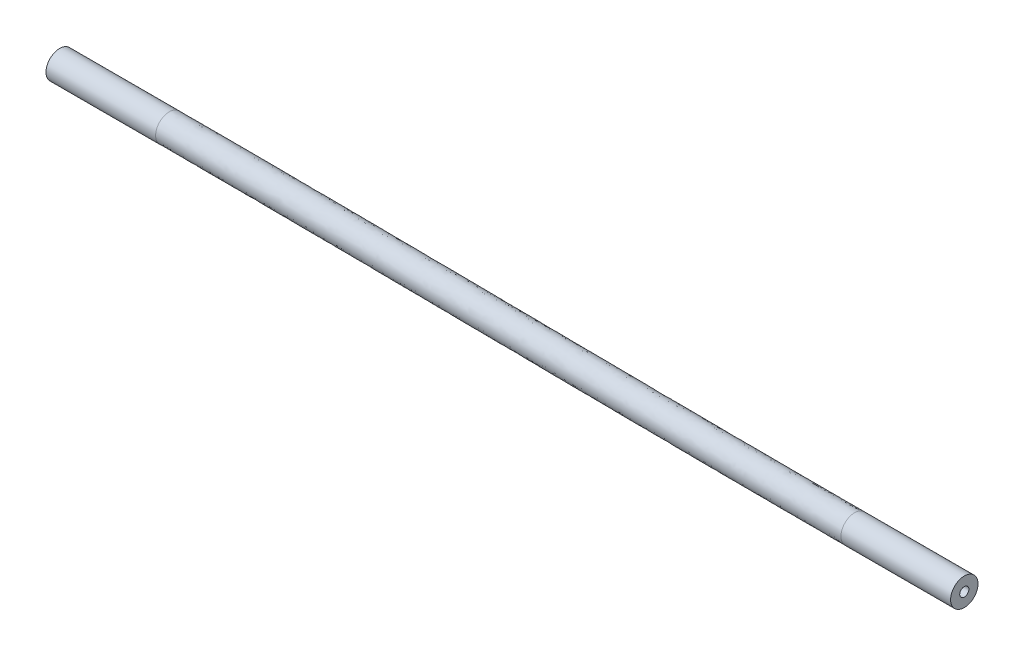
ISO-10303-21;
HEADER;
FILE_DESCRIPTION(('STEP AP214'),'2;1');
FILE_NAME('part.step','',(''),(''),'','','');
FILE_SCHEMA(('AUTOMOTIVE_DESIGN { 1 0 10303 214 1 1 1 1 }'));
ENDSEC;
DATA;
#1=APPLICATION_CONTEXT('core data for automotive mechanical design processes');
#2=APPLICATION_PROTOCOL_DEFINITION('international standard','automotive_design',2000,#1);
#3=PRODUCT_CONTEXT('',#1,'mechanical');
#4=PRODUCT('Part','Part','',(#3));
#5=PRODUCT_RELATED_PRODUCT_CATEGORY('part','',(#4));
#6=PRODUCT_DEFINITION_FORMATION('','',#4);
#7=PRODUCT_DEFINITION_CONTEXT('part definition',#1,'design');
#8=PRODUCT_DEFINITION('design','',#6,#7);
#9=PRODUCT_DEFINITION_SHAPE('','',#8);
#10=(LENGTH_UNIT() NAMED_UNIT(*) SI_UNIT(.MILLI.,.METRE.));
#11=(NAMED_UNIT(*) PLANE_ANGLE_UNIT() SI_UNIT($,.RADIAN.));
#12=(NAMED_UNIT(*) SI_UNIT($,.STERADIAN.) SOLID_ANGLE_UNIT());
#13=UNCERTAINTY_MEASURE_WITH_UNIT(LENGTH_MEASURE(1.E-05),#10,'distance_accuracy_value','');
#14=(GEOMETRIC_REPRESENTATION_CONTEXT(3) GLOBAL_UNCERTAINTY_ASSIGNED_CONTEXT((#13)) GLOBAL_UNIT_ASSIGNED_CONTEXT((#10,
#11,#12)) REPRESENTATION_CONTEXT('',''));
#15=CARTESIAN_POINT('',(0.,0.,0.));
#16=DIRECTION('',(0.,0.,1.));
#17=DIRECTION('',(1.,0.,0.));
#18=AXIS2_PLACEMENT_3D('',#15,#16,#17);
#19=CARTESIAN_POINT('',(98.9999999999895,-0.5,0.));
#20=DIRECTION('',(-1.,0.,0.));
#21=DIRECTION('',(0.,-1.,0.));
#22=AXIS2_PLACEMENT_3D('',#19,#20,#21);
#23=CYLINDRICAL_SURFACE('',#22,1.5);
#24=CARTESIAN_POINT('',(87.,-0.499999999999998,0.));
#25=DIRECTION('',(1.,0.,0.));
#26=DIRECTION('',(0.,0.,-1.));
#27=AXIS2_PLACEMENT_3D('',#24,#25,#26);
#28=CIRCLE('',#27,1.5);
#29=CARTESIAN_POINT('',(87.,-0.499999999999998,-1.5));
#30=VERTEX_POINT('',#29);
#31=EDGE_CURVE('E54',#30,#30,#28,.T.);
#32=ORIENTED_EDGE('',*,*,#31,.T.);
#33=EDGE_LOOP('',(#32));
#34=FACE_BOUND('',#33,.T.);
#35=CARTESIAN_POINT('',(98.9999999999895,-0.5,0.));
#36=DIRECTION('',(1.,0.,0.));
#37=DIRECTION('',(0.,0.,-1.));
#38=AXIS2_PLACEMENT_3D('',#35,#36,#37);
#39=CIRCLE('',#38,1.5);
#40=CARTESIAN_POINT('',(98.9999999999895,-0.5,-1.5));
#41=VERTEX_POINT('',#40);
#42=EDGE_CURVE('E52',#41,#41,#39,.T.);
#43=ORIENTED_EDGE('',*,*,#42,.F.);
#44=EDGE_LOOP('',(#43));
#45=FACE_BOUND('',#44,.T.);
#46=ADVANCED_FACE('F31',(#34,#45),#23,.T.);
#47=CARTESIAN_POINT('',(87.,-0.499999999999998,-1.5));
#48=CARTESIAN_POINT('',(74.4994166426159,-0.499999999999998,-1.5));
#49=CARTESIAN_POINT('',(61.9995833192456,-0.374999999969188,-1.5));
#50=CARTESIAN_POINT('',(37.0004166807542,-0.12500000003081,-1.5));
#51=CARTESIAN_POINT('',(24.500583357384,0.,-1.5));
#52=CARTESIAN_POINT('',(12.,0.,-1.5));
#53=CARTESIAN_POINT('',(87.,2.50000000000001,-1.5));
#54=CARTESIAN_POINT('',(74.5094159759715,2.50000000000001,-1.5));
#55=CARTESIAN_POINT('',(62.0295828192748,2.62485000128055,-1.5));
#56=CARTESIAN_POINT('',(37.0304161807834,2.87485000121893,-1.5));
#57=CARTESIAN_POINT('',(24.5105826907396,3.00000000000001,-1.5));
#58=CARTESIAN_POINT('',(12.,3.00000000000001,-1.5));
#59=CARTESIAN_POINT('',(87.,2.50000000000001,1.5));
#60=CARTESIAN_POINT('',(74.5094159759715,2.50000000000001,1.5));
#61=CARTESIAN_POINT('',(62.0295828192748,2.62485000128055,1.5));
#62=CARTESIAN_POINT('',(37.0304161807834,2.87485000121893,1.5));
#63=CARTESIAN_POINT('',(24.5105826907396,3.00000000000001,1.5));
#64=CARTESIAN_POINT('',(12.,3.00000000000001,1.5));
#65=CARTESIAN_POINT('',(87.,-0.499999999999998,1.5));
#66=CARTESIAN_POINT('',(74.4994166426159,-0.499999999999997,1.5));
#67=CARTESIAN_POINT('',(61.9995833192456,-0.374999999969188,1.5));
#68=CARTESIAN_POINT('',(37.0004166807542,-0.12500000003081,1.5));
#69=CARTESIAN_POINT('',(24.500583357384,0.,1.5));
#70=CARTESIAN_POINT('',(12.,0.,1.5));
#71=CARTESIAN_POINT('',(87.,-3.50000000000001,1.5));
#72=CARTESIAN_POINT('',(74.4894173092604,-3.5,1.5));
#73=CARTESIAN_POINT('',(61.9695838192165,-3.37485000121892,1.5));
#74=CARTESIAN_POINT('',(36.970417180725,-3.12485000128055,1.5));
#75=CARTESIAN_POINT('',(24.4905840240285,-3.00000000000001,1.5));
#76=CARTESIAN_POINT('',(12.,-3.00000000000001,1.5));
#77=CARTESIAN_POINT('',(87.,-3.50000000000001,-1.5));
#78=CARTESIAN_POINT('',(74.4894173092604,-3.5,-1.5));
#79=CARTESIAN_POINT('',(61.9695838192165,-3.37485000121892,-1.5));
#80=CARTESIAN_POINT('',(36.970417180725,-3.12485000128055,-1.5));
#81=CARTESIAN_POINT('',(24.4905840240285,-3.00000000000001,-1.5));
#82=CARTESIAN_POINT('',(12.,-3.00000000000001,-1.5));
#83=CARTESIAN_POINT('',(87.,-0.499999999999998,-1.5));
#84=CARTESIAN_POINT('',(74.4994166426159,-0.499999999999998,-1.5));
#85=CARTESIAN_POINT('',(61.9995833192456,-0.374999999969188,-1.5));
#86=CARTESIAN_POINT('',(37.0004166807542,-0.12500000003081,-1.5));
#87=CARTESIAN_POINT('',(24.500583357384,0.,-1.5));
#88=CARTESIAN_POINT('',(12.,0.,-1.5));
#89=(BOUNDED_SURFACE() B_SPLINE_SURFACE(3,3,((#47,#48,#49,#50,#51,#52),(#53,#54,#55,#56,#57,
#58),(#59,#60,#61,#62,#63,#64),(#65,#66,#67,#68,#69,#70),(#71,#72,#73,#74,#75,#76),(#77,#78,#79,
#80,#81,#82),(#83,#84,#85,#86,#87,#88)),.UNSPECIFIED.,.T.,.F.,
.F.) B_SPLINE_SURFACE_WITH_KNOTS((4,3,4),(4,2,4),(0.,0.5,1.),(0.121209672382494,
0.499999999999947,0.878790327617401),
.UNSPECIFIED.) GEOMETRIC_REPRESENTATION_ITEM() RATIONAL_B_SPLINE_SURFACE(((1.,1.,1.,1.,1.,1.),
(0.333333333333333,0.333333333333333,0.333333333333333,0.333333333333333,0.333333333333333,
0.333333333333333),(0.333333333333333,0.333333333333333,0.333333333333333,0.333333333333333,
0.333333333333333,0.333333333333333),(1.,1.,1.,1.,1.,1.),(0.333333333333333,0.333333333333333,
0.333333333333333,0.333333333333333,0.333333333333333,0.333333333333333),(0.333333333333333,
0.333333333333333,0.333333333333333,0.333333333333333,0.333333333333333,0.333333333333333),(1.,
1.,1.,1.,1.,1.))) REPRESENTATION_ITEM('') SURFACE());
#90=CARTESIAN_POINT('',(12.,0.,0.));
#91=DIRECTION('',(1.,0.,0.));
#92=DIRECTION('',(0.,0.,-1.));
#93=AXIS2_PLACEMENT_3D('',#90,#91,#92);
#94=CIRCLE('',#93,1.5);
#95=CARTESIAN_POINT('',(12.,0.,-1.5));
#96=VERTEX_POINT('',#95);
#97=EDGE_CURVE('E35',#96,#96,#94,.T.);
#98=CARTESIAN_POINT('',(12.,0.,-1.5));
#99=CARTESIAN_POINT('',(12.7812838064446,1.392312673048E-09,-1.5));
#100=CARTESIAN_POINT('',(13.5625675334599,-0.000488277906319333,-1.5));
#101=CARTESIAN_POINT('',(15.125129371996,-0.00238036896634106,-1.5));
#102=CARTESIAN_POINT('',(15.9064074835231,-0.00378417543244554,-1.5));
#103=CARTESIAN_POINT('',(17.4689582922819,-0.00744628539896462,-1.5));
#104=CARTESIAN_POINT('',(18.2502309895223,-0.00970458520281917,-1.5));
#105=CARTESIAN_POINT('',(19.8127712283929,-0.0150146447882255,-1.5));
#106=CARTESIAN_POINT('',(20.5940387700315,-0.0180664020906396,-1.5));
#107=CARTESIAN_POINT('',(22.1565689409835,-0.0249023405321176,-1.5));
#108=CARTESIAN_POINT('',(22.9378315703038,-0.0286865200884703,-1.5));
#109=CARTESIAN_POINT('',(24.5003521640324,-0.0369262670545113,-1.5));
#110=CARTESIAN_POINT('',(25.2816101284457,-0.0413818335127842,-1.5));
#111=CARTESIAN_POINT('',(26.8441216386678,-0.050903318589459,-1.5));
#112=CARTESIAN_POINT('',(27.6253751844799,-0.0559692366740106,-1.5));
#113=CARTESIAN_POINT('',(29.1878781041033,-0.0666503894999829,-1.5));
#114=CARTESIAN_POINT('',(29.9691274779165,-0.072265623958323,-1.5));
#115=CARTESIAN_POINT('',(31.5316223000658,-0.083984374185118,-1.5));
#116=CARTESIAN_POINT('',(32.3128677484031,-0.0900878897969335,-1.5));
#117=CARTESIAN_POINT('',(33.8753549661451,-0.102722167099443,-1.5));
#118=CARTESIAN_POINT('',(34.6565967355506,-0.109252928673607,-1.5));
#119=CARTESIAN_POINT('',(36.2190768419674,-0.122680662734389,-1.5));
#120=CARTESIAN_POINT('',(37.0003151789797,-0.129577635091783,-1.5));
#121=CARTESIAN_POINT('',(38.5627886671489,-0.143676755639944,-1.5));
#122=CARTESIAN_POINT('',(39.3440238183073,-0.150878903665046,-1.5));
#123=CARTESIAN_POINT('',(40.9064911813087,-0.165527340322999,-1.5));
#124=CARTESIAN_POINT('',(41.6877233931536,-0.172973628754582,-1.5));
#125=CARTESIAN_POINT('',(43.2501851240622,-0.188049311598723,-1.5));
#126=CARTESIAN_POINT('',(44.0314146431279,-0.195678705795359,-1.5));
#127=CARTESIAN_POINT('',(45.5938712350351,-0.211059563253201,-1.5));
#128=CARTESIAN_POINT('',(46.3750983078785,-0.218811026320434,-1.5));
#129=CARTESIAN_POINT('',(47.9375502538137,-0.234374993007952,-1.5));
#130=CARTESIAN_POINT('',(48.7187751269068,-0.242187496503976,-1.5));
#131=CARTESIAN_POINT('',(50.281224873093,-0.257812503496022,-1.5));
#132=CARTESIAN_POINT('',(51.0624497461861,-0.265625006992046,-1.5));
#133=CARTESIAN_POINT('',(52.6249016921214,-0.281188973679565,-1.5));
#134=CARTESIAN_POINT('',(53.4061287649648,-0.288940436746798,-1.5));
#135=CARTESIAN_POINT('',(54.968585356872,-0.304321294204639,-1.5));
#136=CARTESIAN_POINT('',(55.7498148759377,-0.311950688401275,-1.5));
#137=CARTESIAN_POINT('',(57.3122766068463,-0.327026371245416,-1.5));
#138=CARTESIAN_POINT('',(58.0935088186912,-0.334472659676999,-1.5));
#139=CARTESIAN_POINT('',(59.6559761816926,-0.349121096334953,-1.5));
#140=CARTESIAN_POINT('',(60.437211332851,-0.356323244360054,-1.5));
#141=CARTESIAN_POINT('',(61.9996848210202,-0.370422364908215,-1.5));
#142=CARTESIAN_POINT('',(62.7809231580325,-0.377319337265609,-1.5));
#143=CARTESIAN_POINT('',(64.3434032644493,-0.390747071326391,-1.5));
#144=CARTESIAN_POINT('',(65.1246450338548,-0.397277832900555,-1.5));
#145=CARTESIAN_POINT('',(66.6871322515968,-0.409912110203065,-1.5));
#146=CARTESIAN_POINT('',(67.4683776999341,-0.41601562581488,-1.5));
#147=CARTESIAN_POINT('',(69.0308725220834,-0.427734376041675,-1.5));
#148=CARTESIAN_POINT('',(69.8121218958967,-0.433349610500015,-1.5));
#149=CARTESIAN_POINT('',(71.37462481552,-0.444030763325987,-1.5));
#150=CARTESIAN_POINT('',(72.1558783613321,-0.449096681410539,-1.5));
#151=CARTESIAN_POINT('',(73.7183898715543,-0.458618166487214,-1.5));
#152=CARTESIAN_POINT('',(74.4996478359676,-0.463073732945487,-1.5));
#153=CARTESIAN_POINT('',(76.0621684296962,-0.471313479911528,-1.5));
#154=CARTESIAN_POINT('',(76.8434310590165,-0.47509765946788,-1.5));
#155=CARTESIAN_POINT('',(78.4059612299685,-0.481933597909358,-1.5));
#156=CARTESIAN_POINT('',(79.1872287716071,-0.484985355211773,-1.5));
#157=CARTESIAN_POINT('',(80.7497690104777,-0.490295414797179,-1.5));
#158=CARTESIAN_POINT('',(81.5310417077181,-0.492553714601033,-1.5));
#159=CARTESIAN_POINT('',(83.0935925164769,-0.496215824567553,-1.5));
#160=CARTESIAN_POINT('',(83.874870628004,-0.497619631033657,-1.5));
#161=CARTESIAN_POINT('',(85.43743246654,-0.499511722093679,-1.5));
#162=CARTESIAN_POINT('',(86.2187161935554,-0.50000000139231,-1.5));
#163=CARTESIAN_POINT('',(87.,-0.499999999999998,-1.5));
#164=B_SPLINE_CURVE_WITH_KNOTS('',3,(#98,#99,#100,#101,#102,#103,#104,#105,#106,#107,#108,#109,
#110,#111,#112,#113,#114,#115,#116,#117,#118,#119,#120,#121,#122,#123,#124,#125,#126,#127,#128,
#129,#130,#131,#132,#133,#134,#135,#136,#137,#138,#139,#140,#141,#142,#143,#144,#145,#146,#147,
#148,#149,#150,#151,#152,#153,#154,#155,#156,#157,#158,#159,#160,#161,#162,#163),.UNSPECIFIED.,
.F.,.F.,(4,2,2,2,2,2,2,2,2,2,2,2,2,2,2,2,2,2,2,2,2,2,2,2,2,2,2,2,2,2,2,2,4),(0.,
2.34385115099598,4.68768874559432,7.03151620080718,9.37533633287918,11.719151400183,
14.0629631461218,16.4067728420363,18.7505813301155,21.0943890663095,23.4381961632435,
25.7820024331322,28.1258074306948,30.4696104960685,32.8134107977234,35.1572073753754,
37.5009991828998,39.8447909904242,42.1885875680762,44.5323878697311,46.8761909351049,
49.2199959326674,51.5638022025562,53.9076092994902,56.2514170356842,58.5952255237634,
60.9390352196779,63.2828469656167,65.6266620329206,67.9704821649926,70.3143096202054,
72.6581472148038,75.0019983657998),.UNSPECIFIED.);
#165=EDGE_CURVE('BSEAM61',#96,#30,#164,.T.);
#166=ORIENTED_EDGE('',*,*,#97,.T.);
#167=ORIENTED_EDGE('',*,*,#31,.F.);
#168=ORIENTED_EDGE('',*,*,#165,.T.);
#169=ORIENTED_EDGE('',*,*,#165,.F.);
#170=EDGE_LOOP('',(#166,#168,#167,#169));
#171=FACE_BOUND('',#170,.T.);
#172=ADVANCED_FACE('F61',(#171),#89,.F.);
#173=CARTESIAN_POINT('',(12.,0.,0.));
#174=DIRECTION('',(-1.,0.,0.));
#175=DIRECTION('',(0.,0.,1.));
#176=AXIS2_PLACEMENT_3D('',#173,#174,#175);
#177=CYLINDRICAL_SURFACE('',#176,1.5);
#178=CARTESIAN_POINT('',(0.,0.,0.));
#179=DIRECTION('',(1.,0.,0.));
#180=DIRECTION('',(0.,0.,-1.));
#181=AXIS2_PLACEMENT_3D('',#178,#179,#180);
#182=CIRCLE('',#181,1.5);
#183=CARTESIAN_POINT('',(0.,0.,-1.5));
#184=VERTEX_POINT('',#183);
#185=EDGE_CURVE('E48',#184,#184,#182,.T.);
#186=ORIENTED_EDGE('',*,*,#185,.T.);
#187=EDGE_LOOP('',(#186));
#188=FACE_BOUND('',#187,.T.);
#189=ORIENTED_EDGE('',*,*,#97,.F.);
#190=EDGE_LOOP('',(#189));
#191=FACE_BOUND('',#190,.T.);
#192=ADVANCED_FACE('F33',(#188,#191),#177,.T.);
#193=CARTESIAN_POINT('',(98.9999999999895,-0.5,0.));
#194=DIRECTION('',(1.,0.,0.));
#195=DIRECTION('',(0.,0.,-1.));
#196=AXIS2_PLACEMENT_3D('',#193,#194,#195);
#197=PLANE('',#196);
#198=CARTESIAN_POINT('',(98.9999999999895,-0.5,0.));
#199=DIRECTION('',(1.,0.,0.));
#200=DIRECTION('',(0.,0.,-1.));
#201=AXIS2_PLACEMENT_3D('',#198,#199,#200);
#202=CIRCLE('',#201,0.5);
#203=CARTESIAN_POINT('',(98.9999999999895,-0.5,-0.5));
#204=VERTEX_POINT('',#203);
#205=EDGE_CURVE('E51',#204,#204,#202,.F.);
#206=ORIENTED_EDGE('',*,*,#205,.T.);
#207=EDGE_LOOP('',(#206));
#208=FACE_BOUND('',#207,.T.);
#209=ORIENTED_EDGE('',*,*,#42,.T.);
#210=EDGE_LOOP('',(#209));
#211=FACE_BOUND('',#210,.T.);
#212=ADVANCED_FACE('F65',(#208,#211),#197,.T.);
#213=CARTESIAN_POINT('',(0.,0.,0.));
#214=DIRECTION('',(1.,0.,0.));
#215=DIRECTION('',(0.,0.,-1.));
#216=AXIS2_PLACEMENT_3D('',#213,#214,#215);
#217=PLANE('',#216);
#218=CARTESIAN_POINT('',(0.,0.,0.));
#219=DIRECTION('',(1.,0.,0.));
#220=DIRECTION('',(0.,0.,-1.));
#221=AXIS2_PLACEMENT_3D('',#218,#219,#220);
#222=CIRCLE('',#221,0.5);
#223=CARTESIAN_POINT('',(0.,0.,-0.5));
#224=VERTEX_POINT('',#223);
#225=EDGE_CURVE('E10',#224,#224,#222,.F.);
#226=ORIENTED_EDGE('',*,*,#225,.F.);
#227=EDGE_LOOP('',(#226));
#228=FACE_BOUND('',#227,.T.);
#229=ORIENTED_EDGE('',*,*,#185,.F.);
#230=EDGE_LOOP('',(#229));
#231=FACE_BOUND('',#230,.T.);
#232=ADVANCED_FACE('F71',(#228,#231),#217,.F.);
#233=CARTESIAN_POINT('',(98.9999999999895,-0.5,0.));
#234=DIRECTION('',(-1.,0.,0.));
#235=DIRECTION('',(0.,-1.,0.));
#236=AXIS2_PLACEMENT_3D('',#233,#234,#235);
#237=CYLINDRICAL_SURFACE('',#236,0.5);
#238=CARTESIAN_POINT('',(87.,-0.499999999999998,0.));
#239=DIRECTION('',(1.,0.,0.));
#240=DIRECTION('',(0.,0.,-1.));
#241=AXIS2_PLACEMENT_3D('',#238,#239,#240);
#242=CIRCLE('',#241,0.5);
#243=CARTESIAN_POINT('',(87.,-0.499999999999998,-0.5));
#244=VERTEX_POINT('',#243);
#245=EDGE_CURVE('E44',#244,#244,#242,.F.);
#246=ORIENTED_EDGE('',*,*,#245,.T.);
#247=EDGE_LOOP('',(#246));
#248=FACE_BOUND('',#247,.T.);
#249=ORIENTED_EDGE('',*,*,#205,.F.);
#250=EDGE_LOOP('',(#249));
#251=FACE_BOUND('',#250,.T.);
#252=ADVANCED_FACE('F81',(#248,#251),#237,.F.);
#253=CARTESIAN_POINT('',(87.,-0.499999999999998,-0.5));
#254=CARTESIAN_POINT('',(61.9988332852319,-0.499999999999997,-0.5));
#255=CARTESIAN_POINT('',(37.0011667147681,0.,-0.5));
#256=CARTESIAN_POINT('',(12.,0.,-0.5));
#257=CARTESIAN_POINT('',(87.,-1.5,-0.5));
#258=CARTESIAN_POINT('',(61.9921670629949,-1.5,-0.5));
#259=CARTESIAN_POINT('',(36.994500492531,-1.,-0.5));
#260=CARTESIAN_POINT('',(12.,-1.,-0.5));
#261=CARTESIAN_POINT('',(87.,-1.5,0.5));
#262=CARTESIAN_POINT('',(61.9921670629949,-1.5,0.5));
#263=CARTESIAN_POINT('',(36.994500492531,-1.,0.5));
#264=CARTESIAN_POINT('',(12.,-1.,0.5));
#265=CARTESIAN_POINT('',(87.,-0.499999999999998,0.5));
#266=CARTESIAN_POINT('',(61.9988332852319,-0.499999999999997,0.5));
#267=CARTESIAN_POINT('',(37.0011667147681,0.,0.5));
#268=CARTESIAN_POINT('',(12.,0.,0.5));
#269=CARTESIAN_POINT('',(87.,0.500000000000002,0.5));
#270=CARTESIAN_POINT('',(62.0054995074689,0.500000000000003,0.5));
#271=CARTESIAN_POINT('',(37.0078329370051,1.,0.5));
#272=CARTESIAN_POINT('',(12.,1.,0.5));
#273=CARTESIAN_POINT('',(87.,0.500000000000002,-0.5));
#274=CARTESIAN_POINT('',(62.0054995074689,0.500000000000003,-0.5));
#275=CARTESIAN_POINT('',(37.0078329370051,1.,-0.5));
#276=CARTESIAN_POINT('',(12.,1.,-0.5));
#277=CARTESIAN_POINT('',(87.,-0.499999999999998,-0.5));
#278=CARTESIAN_POINT('',(61.9988332852319,-0.499999999999997,-0.5));
#279=CARTESIAN_POINT('',(37.0011667147681,0.,-0.5));
#280=CARTESIAN_POINT('',(12.,0.,-0.5));
#281=(BOUNDED_SURFACE() B_SPLINE_SURFACE(3,3,((#253,#254,#255,#256),(#257,#258,#259,#260),(#261,
#262,#263,#264),(#265,#266,#267,#268),(#269,#270,#271,#272),(#273,#274,#275,#276),(#277,#278,
#279,#280)),.UNSPECIFIED.,.T.,.F.,.F.) B_SPLINE_SURFACE_WITH_KNOTS((4,3,4),(4,4),(0.,0.5,1.),
(0.121209672382494,0.878790327617401),
.UNSPECIFIED.) GEOMETRIC_REPRESENTATION_ITEM() RATIONAL_B_SPLINE_SURFACE(((1.,1.,1.,1.),
(0.333333333333333,0.333333333333333,0.333333333333333,0.333333333333333),(0.333333333333333,
0.333333333333333,0.333333333333333,0.333333333333333),(1.,1.,1.,1.),(0.333333333333333,
0.333333333333333,0.333333333333333,0.333333333333333),(0.333333333333333,0.333333333333333,
0.333333333333333,0.333333333333333),(1.,1.,1.,1.))) REPRESENTATION_ITEM('') SURFACE());
#282=CARTESIAN_POINT('',(12.,0.,0.));
#283=DIRECTION('',(1.,0.,0.));
#284=DIRECTION('',(0.,0.,-1.));
#285=AXIS2_PLACEMENT_3D('',#282,#283,#284);
#286=CIRCLE('',#285,0.5);
#287=CARTESIAN_POINT('',(12.,0.,-0.5));
#288=VERTEX_POINT('',#287);
#289=EDGE_CURVE('E39',#288,#288,#286,.F.);
#290=CARTESIAN_POINT('',(12.,0.,-0.5));
#291=CARTESIAN_POINT('',(12.7812833486722,1.61398271693388E-09,-0.5));
#292=CARTESIAN_POINT('',(13.5625666179179,-0.000488277330449803,-0.5));
#293=CARTESIAN_POINT('',(15.125126747443,-0.00238036858072354,-0.5));
#294=CARTESIAN_POINT('',(15.9064036077299,-0.00378417466145288,-0.5));
#295=CARTESIAN_POINT('',(17.4689513036453,-0.00744628473693934,-0.5));
#296=CARTESIAN_POINT('',(18.2502221392843,-0.00970458436755898,-0.5));
#297=CARTESIAN_POINT('',(19.8127582276966,-0.0150146441662639,-0.5));
#298=CARTESIAN_POINT('',(20.5940234804799,-0.0180664014212876,-0.5));
#299=CARTESIAN_POINT('',(22.1565488295749,-0.0249023401247287,-0.5));
#300=CARTESIAN_POINT('',(22.9378089258945,-0.0286865197615564,-0.5));
#301=CARTESIAN_POINT('',(24.5003243925842,-0.036926267047197,-0.5));
#302=CARTESIAN_POINT('',(25.2815797629595,-0.0413818336921492,-0.5));
#303=CARTESIAN_POINT('',(26.8440862071776,-0.0509033191377532,-0.5));
#304=CARTESIAN_POINT('',(27.625337281023,-0.0559692374999285,-0.5));
#305=CARTESIAN_POINT('',(29.1878355618941,-0.0666503907403311,-0.5));
#306=CARTESIAN_POINT('',(29.9690827689203,-0.0722656255500564,-0.5));
#307=CARTESIAN_POINT('',(31.5315737457863,-0.0839843762323245,-0.5));
#308=CARTESIAN_POINT('',(32.3128175156249,-0.0900878922533985,-0.5));
#309=CARTESIAN_POINT('',(33.8753020477696,-0.102722170046012,-0.5));
#310=CARTESIAN_POINT('',(34.6565428100736,-0.109252932068174,-0.5));
#311=CARTESIAN_POINT('',(36.2190217567963,-0.122680666655731,-0.5));
#312=CARTESIAN_POINT('',(37.0002599412128,-0.129577639492427,-0.5));
#313=CARTESIAN_POINT('',(38.5627341618088,-0.143676760574229,-0.5));
#314=CARTESIAN_POINT('',(39.3439701979862,-0.150878909058959,-0.5));
#315=CARTESIAN_POINT('',(40.9064405517516,-0.165527346346553,-0.5));
#316=CARTESIAN_POINT('',(41.6876748693379,-0.172973635329597,-0.5));
#317=CARTESIAN_POINT('',(43.2501422155686,-0.188049318544602,-0.5));
#318=CARTESIAN_POINT('',(44.0313752442118,-0.195678712889647,-0.5));
#319=CARTESIAN_POINT('',(45.5938404422034,-0.2110595717615,-0.5));
#320=CARTESIAN_POINT('',(46.3750726115513,-0.218811036342292,-0.5));
#321=CARTESIAN_POINT('',(47.9375365205995,-0.234375000606019,-0.5));
#322=CARTESIAN_POINT('',(48.7187682602998,-0.242187500303009,-0.5));
#323=CARTESIAN_POINT('',(50.2812317397002,-0.257812499696988,-0.5));
#324=CARTESIAN_POINT('',(51.0624634794004,-0.265624999393978,-0.5));
#325=CARTESIAN_POINT('',(52.6249273884487,-0.281188963657705,-0.5));
#326=CARTESIAN_POINT('',(53.4061595577965,-0.288940428238497,-0.5));
#327=CARTESIAN_POINT('',(54.9686247557882,-0.30432128711035,-0.5));
#328=CARTESIAN_POINT('',(55.7498577844314,-0.311950681455396,-0.5));
#329=CARTESIAN_POINT('',(57.312325130662,-0.3270263646704,-0.5));
#330=CARTESIAN_POINT('',(58.0935594482484,-0.334472653653445,-0.5));
#331=CARTESIAN_POINT('',(59.6560298020138,-0.349121090941039,-0.5));
#332=CARTESIAN_POINT('',(60.4372658381912,-0.356323239425768,-0.5));
#333=CARTESIAN_POINT('',(61.9997400587872,-0.37042236050757,-0.5));
#334=CARTESIAN_POINT('',(62.7809782432036,-0.377319333344266,-0.5));
#335=CARTESIAN_POINT('',(64.3434571899264,-0.390747067931824,-0.5));
#336=CARTESIAN_POINT('',(65.1246979522304,-0.397277829953985,-0.5));
#337=CARTESIAN_POINT('',(66.6871824843751,-0.409912107746599,-0.5));
#338=CARTESIAN_POINT('',(67.4684262542137,-0.416015623767673,-0.5));
#339=CARTESIAN_POINT('',(69.0309172310797,-0.427734374449941,-0.5));
#340=CARTESIAN_POINT('',(69.8121644381059,-0.433349609259667,-0.5));
#341=CARTESIAN_POINT('',(71.374662718977,-0.444030762500069,-0.5));
#342=CARTESIAN_POINT('',(72.1559137928224,-0.449096680862244,-0.5));
#343=CARTESIAN_POINT('',(73.7184202370405,-0.458618166307849,-0.5));
#344=CARTESIAN_POINT('',(74.4996756074158,-0.463073732952801,-0.5));
#345=CARTESIAN_POINT('',(76.0621910741055,-0.471313480238441,-0.5));
#346=CARTESIAN_POINT('',(76.8434511704251,-0.475097659875269,-0.5));
#347=CARTESIAN_POINT('',(78.4059765195201,-0.48193359857871,-0.5));
#348=CARTESIAN_POINT('',(79.1872417723034,-0.484985355833734,-0.5));
#349=CARTESIAN_POINT('',(80.7497778607157,-0.490295415632439,-0.5));
#350=CARTESIAN_POINT('',(81.5310486963547,-0.492553715263059,-0.5));
#351=CARTESIAN_POINT('',(83.0935963922701,-0.496215825338545,-0.5));
#352=CARTESIAN_POINT('',(83.874873252557,-0.497619631419274,-0.5));
#353=CARTESIAN_POINT('',(85.4374333820821,-0.499511722669548,-0.5));
#354=CARTESIAN_POINT('',(86.2187166513278,-0.500000001613981,-0.5));
#355=CARTESIAN_POINT('',(87.,-0.499999999999998,-0.5));
#356=B_SPLINE_CURVE_WITH_KNOTS('',3,(#290,#291,#292,#293,#294,#295,#296,#297,#298,#299,#300,
#301,#302,#303,#304,#305,#306,#307,#308,#309,#310,#311,#312,#313,#314,#315,#316,#317,#318,#319,
#320,#321,#322,#323,#324,#325,#326,#327,#328,#329,#330,#331,#332,#333,#334,#335,#336,#337,#338,
#339,#340,#341,#342,#343,#344,#345,#346,#347,#348,#349,#350,#351,#352,#353,#354,#355),
.UNSPECIFIED.,.F.,.F.,(4,2,2,2,2,2,2,2,2,2,2,2,2,2,2,2,2,2,2,2,2,2,2,2,2,2,2,2,2,2,2,2,4),(0.,
2.34384977768258,4.68768361856284,7.03150548898989,9.37531875454557,11.7191262229358,
14.0629301868897,16.4067324670657,18.7505344549607,21.0943371558244,23.4381412315735,
25.7819470437089,28.125754696232,30.4695640785625,32.8133749084549,35.1571867749152,
37.5009991811175,39.8448115873197,42.1886234537801,44.5324342836724,46.8762436660029,
49.2200513185261,51.5638571306614,53.9076612064105,56.2514639072742,58.5952658951693,
60.9390681753452,63.2828721392992,65.6266796076894,67.9704928732451,70.3143147436722,
72.6581485845524,75.001998362235),.UNSPECIFIED.);
#357=EDGE_CURVE('BSEAM76',#288,#244,#356,.T.);
#358=ORIENTED_EDGE('',*,*,#289,.T.);
#359=ORIENTED_EDGE('',*,*,#245,.F.);
#360=ORIENTED_EDGE('',*,*,#357,.T.);
#361=ORIENTED_EDGE('',*,*,#357,.F.);
#362=EDGE_LOOP('',(#358,#360,#359,#361));
#363=FACE_BOUND('',#362,.T.);
#364=ADVANCED_FACE('F76',(#363),#281,.F.);
#365=CARTESIAN_POINT('',(12.,0.,0.));
#366=DIRECTION('',(-1.,0.,0.));
#367=DIRECTION('',(0.,0.,1.));
#368=AXIS2_PLACEMENT_3D('',#365,#366,#367);
#369=CYLINDRICAL_SURFACE('',#368,0.5);
#370=ORIENTED_EDGE('',*,*,#225,.T.);
#371=EDGE_LOOP('',(#370));
#372=FACE_BOUND('',#371,.T.);
#373=ORIENTED_EDGE('',*,*,#289,.F.);
#374=EDGE_LOOP('',(#373));
#375=FACE_BOUND('',#374,.T.);
#376=ADVANCED_FACE('F74',(#372,#375),#369,.F.);
#377=CLOSED_SHELL('',(#46,#172,#192,#212,#232,#252,#364,#376));
#378=MANIFOLD_SOLID_BREP('B2',#377);
#379=ADVANCED_BREP_SHAPE_REPRESENTATION('',(#18,#378),#14);
#380=SHAPE_DEFINITION_REPRESENTATION(#9,#379);
ENDSEC;
END-ISO-10303-21;
